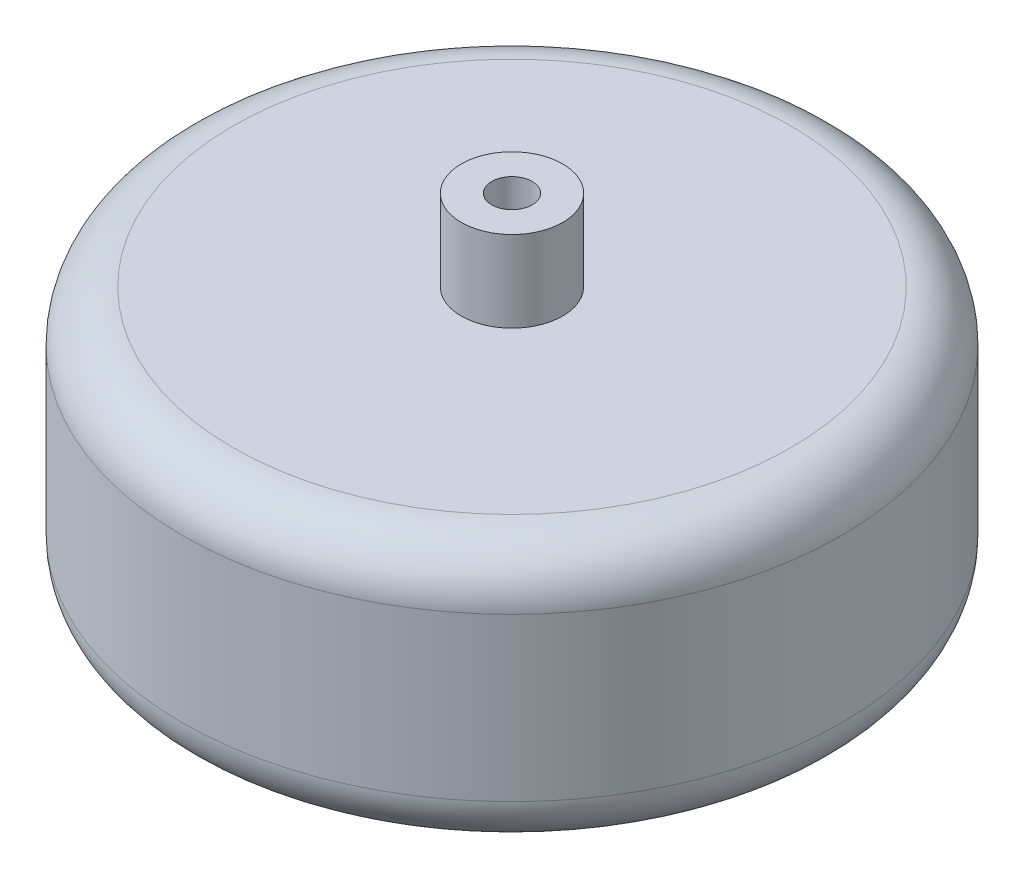
ISO-10303-21;
HEADER;
FILE_DESCRIPTION(('STEP AP214'),'2;1');
FILE_NAME('part.step','',(''),(''),'','','');
FILE_SCHEMA(('AUTOMOTIVE_DESIGN { 1 0 10303 214 1 1 1 1 }'));
ENDSEC;
DATA;
#1=APPLICATION_CONTEXT('core data for automotive mechanical design processes');
#2=APPLICATION_PROTOCOL_DEFINITION('international standard','automotive_design',2000,#1);
#3=PRODUCT_CONTEXT('',#1,'mechanical');
#4=PRODUCT('Part','Part','',(#3));
#5=PRODUCT_RELATED_PRODUCT_CATEGORY('part','',(#4));
#6=PRODUCT_DEFINITION_FORMATION('','',#4);
#7=PRODUCT_DEFINITION_CONTEXT('part definition',#1,'design');
#8=PRODUCT_DEFINITION('design','',#6,#7);
#9=PRODUCT_DEFINITION_SHAPE('','',#8);
#10=(LENGTH_UNIT() NAMED_UNIT(*) SI_UNIT(.MILLI.,.METRE.));
#11=(NAMED_UNIT(*) PLANE_ANGLE_UNIT() SI_UNIT($,.RADIAN.));
#12=(NAMED_UNIT(*) SI_UNIT($,.STERADIAN.) SOLID_ANGLE_UNIT());
#13=UNCERTAINTY_MEASURE_WITH_UNIT(LENGTH_MEASURE(1.E-05),#10,'distance_accuracy_value','');
#14=(GEOMETRIC_REPRESENTATION_CONTEXT(3) GLOBAL_UNCERTAINTY_ASSIGNED_CONTEXT((#13)) GLOBAL_UNIT_ASSIGNED_CONTEXT((#10,
#11,#12)) REPRESENTATION_CONTEXT('',''));
#15=CARTESIAN_POINT('',(0.,0.,0.));
#16=DIRECTION('',(0.,0.,1.));
#17=DIRECTION('',(1.,0.,0.));
#18=AXIS2_PLACEMENT_3D('',#15,#16,#17);
#19=CARTESIAN_POINT('',(0.,26.,0.));
#20=DIRECTION('',(0.,-1.,0.));
#21=DIRECTION('',(0.,0.,-1.));
#22=AXIS2_PLACEMENT_3D('',#19,#20,#21);
#23=CYLINDRICAL_SURFACE('',#22,32.5);
#24=CARTESIAN_POINT('',(0.,5.,0.));
#25=DIRECTION('',(0.,1.,0.));
#26=DIRECTION('',(0.,0.,1.));
#27=AXIS2_PLACEMENT_3D('',#24,#25,#26);
#28=CIRCLE('',#27,32.5);
#29=CARTESIAN_POINT('',(0.,5.,-32.5));
#30=VERTEX_POINT('',#29);
#31=EDGE_CURVE('E50',#30,#30,#28,.T.);
#32=CARTESIAN_POINT('',(0.,21.,0.));
#33=DIRECTION('',(0.,1.,0.));
#34=DIRECTION('',(0.,0.,1.));
#35=AXIS2_PLACEMENT_3D('',#32,#33,#34);
#36=CIRCLE('',#35,32.5);
#37=CARTESIAN_POINT('',(0.,21.,-32.5));
#38=VERTEX_POINT('',#37);
#39=EDGE_CURVE('E55',#38,#38,#36,.F.);
#40=CARTESIAN_POINT('',(0.,5.,-32.5));
#41=CARTESIAN_POINT('',(0.,5.16666666666666,-32.5));
#42=CARTESIAN_POINT('',(0.,5.33333333333333,-32.5));
#43=CARTESIAN_POINT('',(0.,5.66666666666666,-32.5));
#44=CARTESIAN_POINT('',(0.,5.83333333333333,-32.5));
#45=CARTESIAN_POINT('',(0.,6.16666666666667,-32.5));
#46=CARTESIAN_POINT('',(0.,6.33333333333333,-32.5));
#47=CARTESIAN_POINT('',(0.,6.66666666666667,-32.5));
#48=CARTESIAN_POINT('',(0.,6.83333333333333,-32.5));
#49=CARTESIAN_POINT('',(0.,7.16666666666667,-32.5));
#50=CARTESIAN_POINT('',(0.,7.33333333333333,-32.5));
#51=CARTESIAN_POINT('',(0.,7.66666666666666,-32.5));
#52=CARTESIAN_POINT('',(0.,7.83333333333333,-32.5));
#53=CARTESIAN_POINT('',(0.,8.16666666666666,-32.5));
#54=CARTESIAN_POINT('',(0.,8.33333333333333,-32.5));
#55=CARTESIAN_POINT('',(0.,8.66666666666666,-32.5));
#56=CARTESIAN_POINT('',(0.,8.83333333333333,-32.5));
#57=CARTESIAN_POINT('',(0.,9.16666666666666,-32.5));
#58=CARTESIAN_POINT('',(0.,9.33333333333333,-32.5));
#59=CARTESIAN_POINT('',(0.,9.66666666666667,-32.5));
#60=CARTESIAN_POINT('',(0.,9.83333333333333,-32.5));
#61=CARTESIAN_POINT('',(0.,10.1666666666667,-32.5));
#62=CARTESIAN_POINT('',(0.,10.3333333333333,-32.5));
#63=CARTESIAN_POINT('',(0.,10.6666666666667,-32.5));
#64=CARTESIAN_POINT('',(0.,10.8333333333333,-32.5));
#65=CARTESIAN_POINT('',(0.,11.1666666666667,-32.5));
#66=CARTESIAN_POINT('',(0.,11.3333333333333,-32.5));
#67=CARTESIAN_POINT('',(0.,11.6666666666667,-32.5));
#68=CARTESIAN_POINT('',(0.,11.8333333333333,-32.5));
#69=CARTESIAN_POINT('',(0.,12.1666666666667,-32.5));
#70=CARTESIAN_POINT('',(0.,12.3333333333333,-32.5));
#71=CARTESIAN_POINT('',(0.,12.6666666666667,-32.5));
#72=CARTESIAN_POINT('',(0.,12.8333333333333,-32.5));
#73=CARTESIAN_POINT('',(0.,13.1666666666667,-32.5));
#74=CARTESIAN_POINT('',(0.,13.3333333333333,-32.5));
#75=CARTESIAN_POINT('',(0.,13.6666666666667,-32.5));
#76=CARTESIAN_POINT('',(0.,13.8333333333333,-32.5));
#77=CARTESIAN_POINT('',(0.,14.1666666666667,-32.5));
#78=CARTESIAN_POINT('',(0.,14.3333333333333,-32.5));
#79=CARTESIAN_POINT('',(0.,14.6666666666667,-32.5));
#80=CARTESIAN_POINT('',(0.,14.8333333333333,-32.5));
#81=CARTESIAN_POINT('',(0.,15.1666666666667,-32.5));
#82=CARTESIAN_POINT('',(0.,15.3333333333333,-32.5));
#83=CARTESIAN_POINT('',(0.,15.6666666666667,-32.5));
#84=CARTESIAN_POINT('',(0.,15.8333333333333,-32.5));
#85=CARTESIAN_POINT('',(0.,16.1666666666667,-32.5));
#86=CARTESIAN_POINT('',(0.,16.3333333333333,-32.5));
#87=CARTESIAN_POINT('',(0.,16.6666666666667,-32.5));
#88=CARTESIAN_POINT('',(0.,16.8333333333333,-32.5));
#89=CARTESIAN_POINT('',(0.,17.1666666666667,-32.5));
#90=CARTESIAN_POINT('',(0.,17.3333333333333,-32.5));
#91=CARTESIAN_POINT('',(0.,17.6666666666667,-32.5));
#92=CARTESIAN_POINT('',(0.,17.8333333333333,-32.5));
#93=CARTESIAN_POINT('',(0.,18.1666666666667,-32.5));
#94=CARTESIAN_POINT('',(0.,18.3333333333333,-32.5));
#95=CARTESIAN_POINT('',(0.,18.6666666666667,-32.5));
#96=CARTESIAN_POINT('',(0.,18.8333333333333,-32.5));
#97=CARTESIAN_POINT('',(0.,19.1666666666667,-32.5));
#98=CARTESIAN_POINT('',(0.,19.3333333333333,-32.5));
#99=CARTESIAN_POINT('',(0.,19.6666666666667,-32.5));
#100=CARTESIAN_POINT('',(0.,19.8333333333333,-32.5));
#101=CARTESIAN_POINT('',(0.,20.1666666666667,-32.5));
#102=CARTESIAN_POINT('',(0.,20.3333333333333,-32.5));
#103=CARTESIAN_POINT('',(0.,20.6666666666667,-32.5));
#104=CARTESIAN_POINT('',(0.,20.8333333333333,-32.5));
#105=CARTESIAN_POINT('',(0.,21.,-32.5));
#106=B_SPLINE_CURVE_WITH_KNOTS('',3,(#40,#41,#42,#43,#44,#45,#46,#47,#48,#49,#50,#51,#52,#53,
#54,#55,#56,#57,#58,#59,#60,#61,#62,#63,#64,#65,#66,#67,#68,#69,#70,#71,#72,#73,#74,#75,#76,#77,
#78,#79,#80,#81,#82,#83,#84,#85,#86,#87,#88,#89,#90,#91,#92,#93,#94,#95,#96,#97,#98,#99,#100,
#101,#102,#103,#104,#105),.UNSPECIFIED.,.F.,.F.,(4,2,2,2,2,2,2,2,2,2,2,2,2,2,2,2,2,2,2,2,2,2,2,
2,2,2,2,2,2,2,2,2,4),(0.,0.5,1.,1.5,2.,2.5,3.,3.5,4.,4.5,5.,5.5,6.,6.5,7.,7.5,8.,8.5,9.,9.5,10.,
10.5,11.,11.5,12.,12.5,13.,13.5,14.,14.5,15.,15.5,16.),.UNSPECIFIED.);
#107=EDGE_CURVE('BSEAM37',#30,#38,#106,.T.);
#108=ORIENTED_EDGE('',*,*,#31,.T.);
#109=ORIENTED_EDGE('',*,*,#39,.T.);
#110=ORIENTED_EDGE('',*,*,#107,.T.);
#111=ORIENTED_EDGE('',*,*,#107,.F.);
#112=EDGE_LOOP('',(#108,#110,#109,#111));
#113=FACE_BOUND('',#112,.T.);
#114=ADVANCED_FACE('F37',(#113),#23,.T.);
#115=CARTESIAN_POINT('',(0.,26.,0.));
#116=DIRECTION('',(0.,1.,0.));
#117=DIRECTION('',(0.,0.,1.));
#118=AXIS2_PLACEMENT_3D('',#115,#116,#117);
#119=PLANE('',#118);
#120=CARTESIAN_POINT('',(0.,26.,0.));
#121=DIRECTION('',(0.,1.,0.));
#122=DIRECTION('',(0.,0.,1.));
#123=AXIS2_PLACEMENT_3D('',#120,#121,#122);
#124=CIRCLE('',#123,27.5);
#125=CARTESIAN_POINT('',(0.,26.,27.5));
#126=VERTEX_POINT('',#125);
#127=EDGE_CURVE('E10',#126,#126,#124,.T.);
#128=ORIENTED_EDGE('',*,*,#127,.T.);
#129=EDGE_LOOP('',(#128));
#130=FACE_BOUND('',#129,.T.);
#131=CARTESIAN_POINT('',(0.,26.,0.));
#132=DIRECTION('',(0.,1.,0.));
#133=DIRECTION('',(0.,0.,1.));
#134=AXIS2_PLACEMENT_3D('',#131,#132,#133);
#135=CIRCLE('',#134,5.);
#136=CARTESIAN_POINT('',(0.,26.,5.));
#137=VERTEX_POINT('',#136);
#138=EDGE_CURVE('E61',#137,#137,#135,.T.);
#139=ORIENTED_EDGE('',*,*,#138,.F.);
#140=EDGE_LOOP('',(#139));
#141=FACE_BOUND('',#140,.T.);
#142=ADVANCED_FACE('F99',(#130,#141),#119,.T.);
#143=CARTESIAN_POINT('',(0.,0.,0.));
#144=DIRECTION('',(0.,1.,0.));
#145=DIRECTION('',(0.,0.,1.));
#146=AXIS2_PLACEMENT_3D('',#143,#144,#145);
#147=PLANE('',#146);
#148=CARTESIAN_POINT('',(0.,0.,0.));
#149=DIRECTION('',(0.,1.,0.));
#150=DIRECTION('',(0.,0.,1.));
#151=AXIS2_PLACEMENT_3D('',#148,#149,#150);
#152=CIRCLE('',#151,27.5);
#153=CARTESIAN_POINT('',(0.,0.,27.5));
#154=VERTEX_POINT('',#153);
#155=EDGE_CURVE('E45',#154,#154,#152,.F.);
#156=ORIENTED_EDGE('',*,*,#155,.T.);
#157=EDGE_LOOP('',(#156));
#158=FACE_BOUND('',#157,.T.);
#159=ADVANCED_FACE('F95',(#158),#147,.F.);
#160=CARTESIAN_POINT('',(0.,34.,0.));
#161=DIRECTION('',(0.,-1.,0.));
#162=DIRECTION('',(0.,0.,-1.));
#163=AXIS2_PLACEMENT_3D('',#160,#161,#162);
#164=CYLINDRICAL_SURFACE('',#163,5.);
#165=CARTESIAN_POINT('',(0.,34.,0.));
#166=DIRECTION('',(0.,1.,0.));
#167=DIRECTION('',(0.,0.,1.));
#168=AXIS2_PLACEMENT_3D('',#165,#166,#167);
#169=CIRCLE('',#168,5.);
#170=CARTESIAN_POINT('',(0.,34.,5.));
#171=VERTEX_POINT('',#170);
#172=EDGE_CURVE('E65',#171,#171,#169,.T.);
#173=ORIENTED_EDGE('',*,*,#172,.F.);
#174=EDGE_LOOP('',(#173));
#175=FACE_BOUND('',#174,.T.);
#176=ORIENTED_EDGE('',*,*,#138,.T.);
#177=EDGE_LOOP('',(#176));
#178=FACE_BOUND('',#177,.T.);
#179=ADVANCED_FACE('F89',(#175,#178),#164,.T.);
#180=CARTESIAN_POINT('',(0.,34.,0.));
#181=DIRECTION('',(0.,1.,0.));
#182=DIRECTION('',(0.,0.,1.));
#183=AXIS2_PLACEMENT_3D('',#180,#181,#182);
#184=PLANE('',#183);
#185=CARTESIAN_POINT('',(0.,34.,0.));
#186=DIRECTION('',(0.,1.,0.));
#187=DIRECTION('',(0.,0.,1.));
#188=AXIS2_PLACEMENT_3D('',#185,#186,#187);
#189=CIRCLE('',#188,2.);
#190=CARTESIAN_POINT('',(0.,34.,2.));
#191=VERTEX_POINT('',#190);
#192=EDGE_CURVE('E70',#191,#191,#189,.T.);
#193=ORIENTED_EDGE('',*,*,#192,.F.);
#194=EDGE_LOOP('',(#193));
#195=FACE_BOUND('',#194,.T.);
#196=ORIENTED_EDGE('',*,*,#172,.T.);
#197=EDGE_LOOP('',(#196));
#198=FACE_BOUND('',#197,.T.);
#199=ADVANCED_FACE('F83',(#195,#198),#184,.T.);
#200=CARTESIAN_POINT('',(0.,26.,0.));
#201=DIRECTION('',(0.,1.,0.));
#202=DIRECTION('',(0.,0.,1.));
#203=AXIS2_PLACEMENT_3D('',#200,#201,#202);
#204=CYLINDRICAL_SURFACE('',#203,2.);
#205=CARTESIAN_POINT('',(0.,26.,0.));
#206=DIRECTION('',(0.,1.,0.));
#207=DIRECTION('',(0.,0.,1.));
#208=AXIS2_PLACEMENT_3D('',#205,#206,#207);
#209=CIRCLE('',#208,2.);
#210=CARTESIAN_POINT('',(0.,26.,2.));
#211=VERTEX_POINT('',#210);
#212=EDGE_CURVE('E69',#211,#211,#209,.T.);
#213=ORIENTED_EDGE('',*,*,#212,.F.);
#214=EDGE_LOOP('',(#213));
#215=FACE_BOUND('',#214,.T.);
#216=ORIENTED_EDGE('',*,*,#192,.T.);
#217=EDGE_LOOP('',(#216));
#218=FACE_BOUND('',#217,.T.);
#219=ADVANCED_FACE('F80',(#215,#218),#204,.F.);
#220=CARTESIAN_POINT('',(0.,26.,0.));
#221=DIRECTION('',(0.,1.,0.));
#222=DIRECTION('',(0.,0.,1.));
#223=AXIS2_PLACEMENT_3D('',#220,#221,#222);
#224=PLANE('',#223);
#225=ORIENTED_EDGE('',*,*,#212,.T.);
#226=EDGE_LOOP('',(#225));
#227=FACE_BOUND('',#226,.T.);
#228=ADVANCED_FACE('F78',(#227),#224,.T.);
#229=CARTESIAN_POINT('',(0.,5.,0.));
#230=DIRECTION('',(0.,1.,0.));
#231=DIRECTION('',(0.,0.,1.));
#232=AXIS2_PLACEMENT_3D('',#229,#230,#231);
#233=TOROIDAL_SURFACE('',#232,27.5,5.);
#234=ORIENTED_EDGE('',*,*,#155,.F.);
#235=EDGE_LOOP('',(#234));
#236=FACE_BOUND('',#235,.T.);
#237=ORIENTED_EDGE('',*,*,#31,.F.);
#238=EDGE_LOOP('',(#237));
#239=FACE_BOUND('',#238,.T.);
#240=ADVANCED_FACE('F109',(#236,#239),#233,.T.);
#241=CARTESIAN_POINT('',(0.,21.,0.));
#242=DIRECTION('',(0.,1.,0.));
#243=DIRECTION('',(0.,0.,1.));
#244=AXIS2_PLACEMENT_3D('',#241,#242,#243);
#245=TOROIDAL_SURFACE('',#244,27.5,5.);
#246=ORIENTED_EDGE('',*,*,#39,.F.);
#247=EDGE_LOOP('',(#246));
#248=FACE_BOUND('',#247,.T.);
#249=ORIENTED_EDGE('',*,*,#127,.F.);
#250=EDGE_LOOP('',(#249));
#251=FACE_BOUND('',#250,.T.);
#252=ADVANCED_FACE('F39',(#248,#251),#245,.T.);
#253=CLOSED_SHELL('',(#114,#142,#159,#179,#199,#219,#228,#240,#252));
#254=MANIFOLD_SOLID_BREP('B2',#253);
#255=ADVANCED_BREP_SHAPE_REPRESENTATION('',(#18,#254),#14);
#256=SHAPE_DEFINITION_REPRESENTATION(#9,#255);
ENDSEC;
END-ISO-10303-21;
